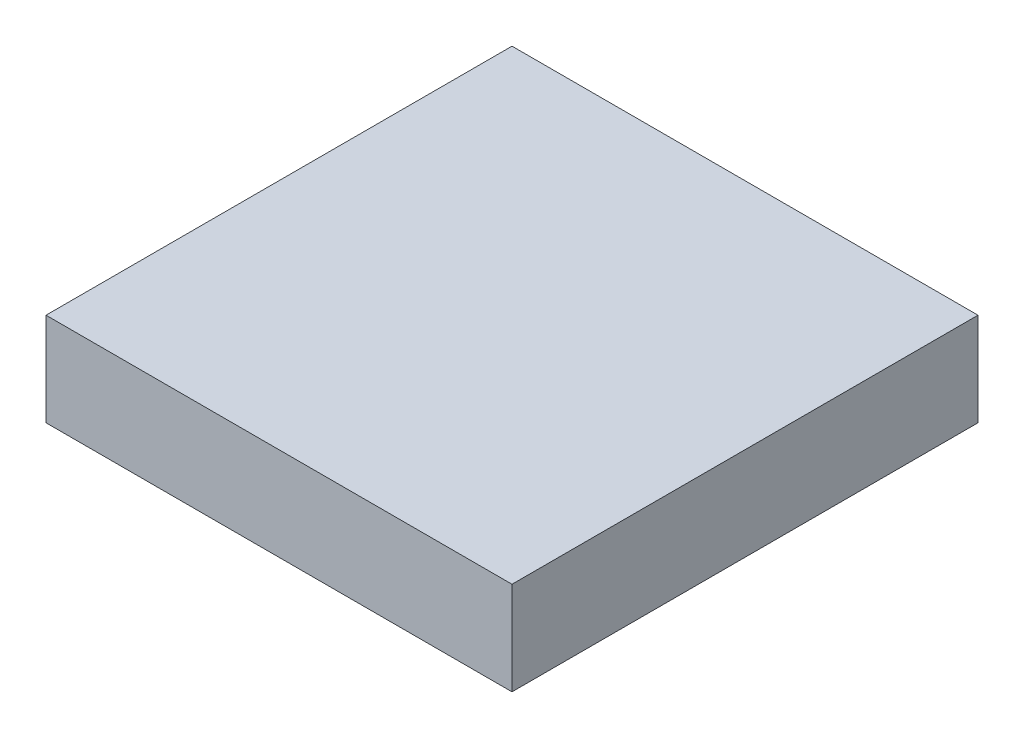
ISO-10303-21;
HEADER;
FILE_DESCRIPTION(('STEP AP214'),'2;1');
FILE_NAME('part.step','',(''),(''),'','','');
FILE_SCHEMA(('AUTOMOTIVE_DESIGN { 1 0 10303 214 1 1 1 1 }'));
ENDSEC;
DATA;
#1=APPLICATION_CONTEXT('core data for automotive mechanical design processes');
#2=APPLICATION_PROTOCOL_DEFINITION('international standard','automotive_design',2000,#1);
#3=PRODUCT_CONTEXT('',#1,'mechanical');
#4=PRODUCT('Part','Part','',(#3));
#5=PRODUCT_RELATED_PRODUCT_CATEGORY('part','',(#4));
#6=PRODUCT_DEFINITION_FORMATION('','',#4);
#7=PRODUCT_DEFINITION_CONTEXT('part definition',#1,'design');
#8=PRODUCT_DEFINITION('design','',#6,#7);
#9=PRODUCT_DEFINITION_SHAPE('','',#8);
#10=(LENGTH_UNIT() NAMED_UNIT(*) SI_UNIT(.MILLI.,.METRE.));
#11=(NAMED_UNIT(*) PLANE_ANGLE_UNIT() SI_UNIT($,.RADIAN.));
#12=(NAMED_UNIT(*) SI_UNIT($,.STERADIAN.) SOLID_ANGLE_UNIT());
#13=UNCERTAINTY_MEASURE_WITH_UNIT(LENGTH_MEASURE(1.E-05),#10,'distance_accuracy_value','');
#14=(GEOMETRIC_REPRESENTATION_CONTEXT(3) GLOBAL_UNCERTAINTY_ASSIGNED_CONTEXT((#13)) GLOBAL_UNIT_ASSIGNED_CONTEXT((#10,
#11,#12)) REPRESENTATION_CONTEXT('',''));
#15=CARTESIAN_POINT('',(0.,0.,0.));
#16=DIRECTION('',(0.,0.,1.));
#17=DIRECTION('',(1.,0.,0.));
#18=AXIS2_PLACEMENT_3D('',#15,#16,#17);
#19=CARTESIAN_POINT('',(50000.,20000.,-50000.));
#20=DIRECTION('',(-1.,0.,0.));
#21=DIRECTION('',(0.,0.,1.));
#22=AXIS2_PLACEMENT_3D('',#19,#20,#21);
#23=PLANE('',#22);
#24=DIRECTION('',(0.,0.,-1.));
#25=VECTOR('',#24,1.);
#26=CARTESIAN_POINT('',(50000.,0.,-50000.));
#27=LINE('',#26,#25);
#28=CARTESIAN_POINT('',(50000.,0.,50000.));
#29=VERTEX_POINT('',#28);
#30=CARTESIAN_POINT('',(50000.,0.,-50000.));
#31=VERTEX_POINT('',#30);
#32=EDGE_CURVE('E96',#29,#31,#27,.T.);
#33=ORIENTED_EDGE('',*,*,#32,.T.);
#34=DIRECTION('',(0.,-1.,0.));
#35=VECTOR('',#34,1.);
#36=CARTESIAN_POINT('',(50000.,20000.,-50000.));
#37=LINE('',#36,#35);
#38=CARTESIAN_POINT('',(50000.,20000.,-50000.));
#39=VERTEX_POINT('',#38);
#40=EDGE_CURVE('E11',#39,#31,#37,.T.);
#41=ORIENTED_EDGE('',*,*,#40,.F.);
#42=DIRECTION('',(0.,0.,-1.));
#43=VECTOR('',#42,1.);
#44=CARTESIAN_POINT('',(50000.,20000.,-50000.));
#45=LINE('',#44,#43);
#46=CARTESIAN_POINT('',(50000.,20000.,50000.));
#47=VERTEX_POINT('',#46);
#48=EDGE_CURVE('E84',#47,#39,#45,.T.);
#49=ORIENTED_EDGE('',*,*,#48,.F.);
#50=DIRECTION('',(0.,-1.,0.));
#51=VECTOR('',#50,1.);
#52=CARTESIAN_POINT('',(50000.,20000.,50000.));
#53=LINE('',#52,#51);
#54=EDGE_CURVE('E92',#47,#29,#53,.T.);
#55=ORIENTED_EDGE('',*,*,#54,.T.);
#56=EDGE_LOOP('',(#33,#41,#49,#55));
#57=FACE_BOUND('',#56,.T.);
#58=ADVANCED_FACE('F33',(#57),#23,.F.);
#59=CARTESIAN_POINT('',(-50000.,20000.,-50000.));
#60=DIRECTION('',(0.,0.,1.));
#61=DIRECTION('',(1.,0.,0.));
#62=AXIS2_PLACEMENT_3D('',#59,#60,#61);
#63=PLANE('',#62);
#64=DIRECTION('',(-1.,0.,0.));
#65=VECTOR('',#64,1.);
#66=CARTESIAN_POINT('',(-50000.,0.,-50000.));
#67=LINE('',#66,#65);
#68=CARTESIAN_POINT('',(-50000.,0.,-50000.));
#69=VERTEX_POINT('',#68);
#70=EDGE_CURVE('E88',#31,#69,#67,.T.);
#71=ORIENTED_EDGE('',*,*,#70,.T.);
#72=DIRECTION('',(0.,-1.,0.));
#73=VECTOR('',#72,1.);
#74=CARTESIAN_POINT('',(-50000.,20000.,-50000.));
#75=LINE('',#74,#73);
#76=CARTESIAN_POINT('',(-50000.,20000.,-50000.));
#77=VERTEX_POINT('',#76);
#78=EDGE_CURVE('E41',#77,#69,#75,.T.);
#79=ORIENTED_EDGE('',*,*,#78,.F.);
#80=DIRECTION('',(-1.,0.,0.));
#81=VECTOR('',#80,1.);
#82=CARTESIAN_POINT('',(-50000.,20000.,-50000.));
#83=LINE('',#82,#81);
#84=EDGE_CURVE('E79',#39,#77,#83,.T.);
#85=ORIENTED_EDGE('',*,*,#84,.F.);
#86=ORIENTED_EDGE('',*,*,#40,.T.);
#87=EDGE_LOOP('',(#71,#79,#85,#86));
#88=FACE_BOUND('',#87,.T.);
#89=ADVANCED_FACE('F87',(#88),#63,.F.);
#90=CARTESIAN_POINT('',(-50000.,20000.,-50000.));
#91=DIRECTION('',(1.,0.,0.));
#92=DIRECTION('',(0.,0.,-1.));
#93=AXIS2_PLACEMENT_3D('',#90,#91,#92);
#94=PLANE('',#93);
#95=DIRECTION('',(0.,0.,1.));
#96=VECTOR('',#95,1.);
#97=CARTESIAN_POINT('',(-50000.,0.,-50000.));
#98=LINE('',#97,#96);
#99=CARTESIAN_POINT('',(-50000.,0.,50000.));
#100=VERTEX_POINT('',#99);
#101=EDGE_CURVE('E66',#69,#100,#98,.T.);
#102=ORIENTED_EDGE('',*,*,#101,.T.);
#103=DIRECTION('',(0.,-1.,0.));
#104=VECTOR('',#103,1.);
#105=CARTESIAN_POINT('',(-50000.,20000.,50000.));
#106=LINE('',#105,#104);
#107=CARTESIAN_POINT('',(-50000.,20000.,50000.));
#108=VERTEX_POINT('',#107);
#109=EDGE_CURVE('E89',#108,#100,#106,.T.);
#110=ORIENTED_EDGE('',*,*,#109,.F.);
#111=DIRECTION('',(0.,0.,1.));
#112=VECTOR('',#111,1.);
#113=CARTESIAN_POINT('',(-50000.,20000.,-50000.));
#114=LINE('',#113,#112);
#115=EDGE_CURVE('E82',#77,#108,#114,.T.);
#116=ORIENTED_EDGE('',*,*,#115,.F.);
#117=ORIENTED_EDGE('',*,*,#78,.T.);
#118=EDGE_LOOP('',(#102,#110,#116,#117));
#119=FACE_BOUND('',#118,.T.);
#120=ADVANCED_FACE('F90',(#119),#94,.F.);
#121=CARTESIAN_POINT('',(-50000.,20000.,50000.));
#122=DIRECTION('',(0.,0.,-1.));
#123=DIRECTION('',(-1.,0.,0.));
#124=AXIS2_PLACEMENT_3D('',#121,#122,#123);
#125=PLANE('',#124);
#126=DIRECTION('',(1.,0.,0.));
#127=VECTOR('',#126,1.);
#128=CARTESIAN_POINT('',(-50000.,0.,50000.));
#129=LINE('',#128,#127);
#130=EDGE_CURVE('E72',#100,#29,#129,.T.);
#131=ORIENTED_EDGE('',*,*,#130,.T.);
#132=ORIENTED_EDGE('',*,*,#54,.F.);
#133=DIRECTION('',(1.,0.,0.));
#134=VECTOR('',#133,1.);
#135=CARTESIAN_POINT('',(-50000.,20000.,50000.));
#136=LINE('',#135,#134);
#137=EDGE_CURVE('E49',#108,#47,#136,.T.);
#138=ORIENTED_EDGE('',*,*,#137,.F.);
#139=ORIENTED_EDGE('',*,*,#109,.T.);
#140=EDGE_LOOP('',(#131,#132,#138,#139));
#141=FACE_BOUND('',#140,.T.);
#142=ADVANCED_FACE('F103',(#141),#125,.F.);
#143=CARTESIAN_POINT('',(0.,20000.,0.));
#144=DIRECTION('',(0.,1.,0.));
#145=DIRECTION('',(0.,0.,1.));
#146=AXIS2_PLACEMENT_3D('',#143,#144,#145);
#147=PLANE('',#146);
#148=ORIENTED_EDGE('',*,*,#48,.T.);
#149=ORIENTED_EDGE('',*,*,#84,.T.);
#150=ORIENTED_EDGE('',*,*,#115,.T.);
#151=ORIENTED_EDGE('',*,*,#137,.T.);
#152=EDGE_LOOP('',(#148,#149,#150,#151));
#153=FACE_BOUND('',#152,.T.);
#154=ADVANCED_FACE('F80',(#153),#147,.T.);
#155=CARTESIAN_POINT('',(0.,0.,0.));
#156=DIRECTION('',(0.,1.,0.));
#157=DIRECTION('',(0.,0.,1.));
#158=AXIS2_PLACEMENT_3D('',#155,#156,#157);
#159=PLANE('',#158);
#160=ORIENTED_EDGE('',*,*,#32,.F.);
#161=ORIENTED_EDGE('',*,*,#130,.F.);
#162=ORIENTED_EDGE('',*,*,#101,.F.);
#163=ORIENTED_EDGE('',*,*,#70,.F.);
#164=EDGE_LOOP('',(#160,#161,#162,#163));
#165=FACE_BOUND('',#164,.T.);
#166=ADVANCED_FACE('F106',(#165),#159,.F.);
#167=CLOSED_SHELL('',(#58,#89,#120,#142,#154,#166));
#168=MANIFOLD_SOLID_BREP('B2',#167);
#169=ADVANCED_BREP_SHAPE_REPRESENTATION('',(#18,#168),#14);
#170=SHAPE_DEFINITION_REPRESENTATION(#9,#169);
ENDSEC;
END-ISO-10303-21;
